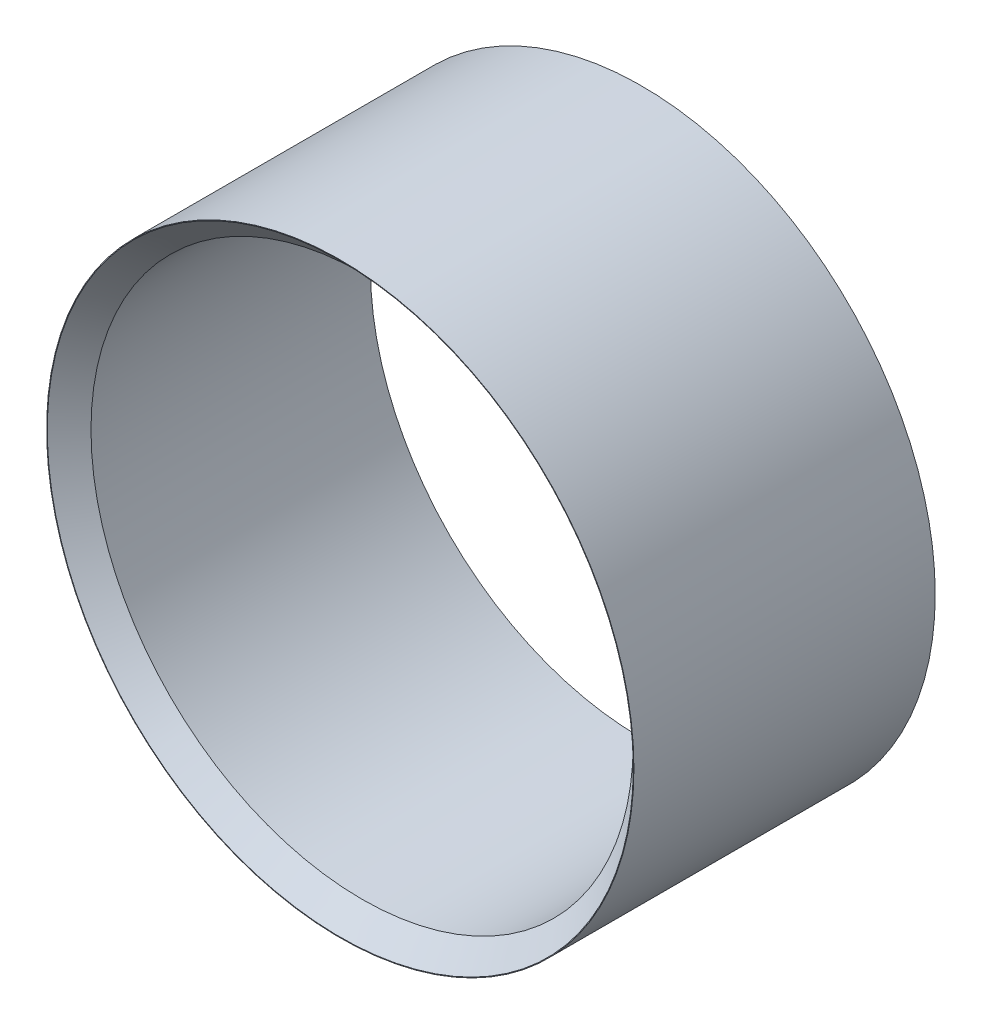
ISO-10303-21;
HEADER;
FILE_DESCRIPTION(('STEP AP214'),'2;1');
FILE_NAME('part.step','',(''),(''),'','','');
FILE_SCHEMA(('AUTOMOTIVE_DESIGN { 1 0 10303 214 1 1 1 1 }'));
ENDSEC;
DATA;
#1=APPLICATION_CONTEXT('core data for automotive mechanical design processes');
#2=APPLICATION_PROTOCOL_DEFINITION('international standard','automotive_design',2000,#1);
#3=PRODUCT_CONTEXT('',#1,'mechanical');
#4=PRODUCT('Part','Part','',(#3));
#5=PRODUCT_RELATED_PRODUCT_CATEGORY('part','',(#4));
#6=PRODUCT_DEFINITION_FORMATION('','',#4);
#7=PRODUCT_DEFINITION_CONTEXT('part definition',#1,'design');
#8=PRODUCT_DEFINITION('design','',#6,#7);
#9=PRODUCT_DEFINITION_SHAPE('','',#8);
#10=(LENGTH_UNIT() NAMED_UNIT(*) SI_UNIT(.MILLI.,.METRE.));
#11=(NAMED_UNIT(*) PLANE_ANGLE_UNIT() SI_UNIT($,.RADIAN.));
#12=(NAMED_UNIT(*) SI_UNIT($,.STERADIAN.) SOLID_ANGLE_UNIT());
#13=UNCERTAINTY_MEASURE_WITH_UNIT(LENGTH_MEASURE(1.E-05),#10,'distance_accuracy_value','');
#14=(GEOMETRIC_REPRESENTATION_CONTEXT(3) GLOBAL_UNCERTAINTY_ASSIGNED_CONTEXT((#13)) GLOBAL_UNIT_ASSIGNED_CONTEXT((#10,
#11,#12)) REPRESENTATION_CONTEXT('',''));
#15=CARTESIAN_POINT('',(0.,0.,0.));
#16=DIRECTION('',(0.,0.,1.));
#17=DIRECTION('',(1.,0.,0.));
#18=AXIS2_PLACEMENT_3D('',#15,#16,#17);
#19=CARTESIAN_POINT('',(0.,0.,17.5006));
#20=DIRECTION('',(0.,0.,1.));
#21=DIRECTION('',(1.,0.,0.));
#22=AXIS2_PLACEMENT_3D('',#19,#20,#21);
#23=PLANE('',#22);
#24=CARTESIAN_POINT('',(0.,0.,17.5006));
#25=DIRECTION('',(0.,0.,1.));
#26=DIRECTION('',(1.,0.,0.));
#27=AXIS2_PLACEMENT_3D('',#24,#25,#26);
#28=CIRCLE('',#27,17.018);
#29=CARTESIAN_POINT('',(17.018,0.,17.5006));
#30=VERTEX_POINT('',#29);
#31=EDGE_CURVE('E10',#30,#30,#28,.F.);
#32=ORIENTED_EDGE('',*,*,#31,.T.);
#33=EDGE_LOOP('',(#32));
#34=FACE_BOUND('',#33,.T.);
#35=CARTESIAN_POINT('',(0.,0.,17.5006));
#36=DIRECTION('',(0.,0.,1.));
#37=DIRECTION('',(1.,0.,0.));
#38=AXIS2_PLACEMENT_3D('',#35,#36,#37);
#39=CIRCLE('',#38,17.0561);
#40=CARTESIAN_POINT('',(17.0561,0.,17.5006));
#41=VERTEX_POINT('',#40);
#42=EDGE_CURVE('E51',#41,#41,#39,.T.);
#43=ORIENTED_EDGE('',*,*,#42,.T.);
#44=EDGE_LOOP('',(#43));
#45=FACE_BOUND('',#44,.T.);
#46=ADVANCED_FACE('F39',(#34,#45),#23,.T.);
#47=CARTESIAN_POINT('',(0.,0.,0.));
#48=DIRECTION('',(0.,0.,1.));
#49=DIRECTION('',(1.,0.,0.));
#50=AXIS2_PLACEMENT_3D('',#47,#48,#49);
#51=PLANE('',#50);
#52=CARTESIAN_POINT('',(0.,0.,0.));
#53=DIRECTION('',(0.,0.,1.));
#54=DIRECTION('',(1.,0.,0.));
#55=AXIS2_PLACEMENT_3D('',#52,#53,#54);
#56=CIRCLE('',#55,17.0561);
#57=CARTESIAN_POINT('',(17.0561,0.,0.));
#58=VERTEX_POINT('',#57);
#59=EDGE_CURVE('E55',#58,#58,#56,.T.);
#60=ORIENTED_EDGE('',*,*,#59,.F.);
#61=EDGE_LOOP('',(#60));
#62=FACE_BOUND('',#61,.T.);
#63=CARTESIAN_POINT('',(0.,0.,0.));
#64=DIRECTION('',(0.,0.,1.));
#65=DIRECTION('',(1.,0.,0.));
#66=AXIS2_PLACEMENT_3D('',#63,#64,#65);
#67=CIRCLE('',#66,15.748);
#68=CARTESIAN_POINT('',(15.748,0.,0.));
#69=VERTEX_POINT('',#68);
#70=EDGE_CURVE('E59',#69,#69,#67,.T.);
#71=ORIENTED_EDGE('',*,*,#70,.T.);
#72=EDGE_LOOP('',(#71));
#73=FACE_BOUND('',#72,.T.);
#74=ADVANCED_FACE('F64',(#62,#73),#51,.F.);
#75=CARTESIAN_POINT('',(0.,0.,17.5006));
#76=DIRECTION('',(0.,0.,-1.));
#77=DIRECTION('',(-1.,0.,0.));
#78=AXIS2_PLACEMENT_3D('',#75,#76,#77);
#79=CYLINDRICAL_SURFACE('',#78,17.0561);
#80=ORIENTED_EDGE('',*,*,#42,.F.);
#81=EDGE_LOOP('',(#80));
#82=FACE_BOUND('',#81,.T.);
#83=ORIENTED_EDGE('',*,*,#59,.T.);
#84=EDGE_LOOP('',(#83));
#85=FACE_BOUND('',#84,.T.);
#86=ADVANCED_FACE('F68',(#82,#85),#79,.T.);
#87=CARTESIAN_POINT('',(0.,0.,17.5006));
#88=DIRECTION('',(0.,0.,-1.));
#89=DIRECTION('',(-1.,0.,0.));
#90=AXIS2_PLACEMENT_3D('',#87,#88,#89);
#91=CYLINDRICAL_SURFACE('',#90,15.748);
#92=CARTESIAN_POINT('',(0.,0.,16.2306));
#93=DIRECTION('',(0.,0.,1.));
#94=DIRECTION('',(1.,0.,0.));
#95=AXIS2_PLACEMENT_3D('',#92,#93,#94);
#96=CIRCLE('',#95,15.748);
#97=CARTESIAN_POINT('',(15.748,0.,16.2306));
#98=VERTEX_POINT('',#97);
#99=EDGE_CURVE('E47',#98,#98,#96,.T.);
#100=ORIENTED_EDGE('',*,*,#99,.T.);
#101=EDGE_LOOP('',(#100));
#102=FACE_BOUND('',#101,.T.);
#103=ORIENTED_EDGE('',*,*,#70,.F.);
#104=EDGE_LOOP('',(#103));
#105=FACE_BOUND('',#104,.T.);
#106=ADVANCED_FACE('F66',(#102,#105),#91,.F.);
#107=CARTESIAN_POINT('',(0.,0.,16.2306));
#108=DIRECTION('',(0.,0.,1.));
#109=DIRECTION('',(1.,0.,0.));
#110=AXIS2_PLACEMENT_3D('',#107,#108,#109);
#111=CONICAL_SURFACE('',#110,15.748,0.785398163397451);
#112=ORIENTED_EDGE('',*,*,#31,.F.);
#113=EDGE_LOOP('',(#112));
#114=FACE_BOUND('',#113,.T.);
#115=ORIENTED_EDGE('',*,*,#99,.F.);
#116=EDGE_LOOP('',(#115));
#117=FACE_BOUND('',#116,.T.);
#118=ADVANCED_FACE('F42',(#114,#117),#111,.F.);
#119=CLOSED_SHELL('',(#46,#74,#86,#106,#118));
#120=MANIFOLD_SOLID_BREP('B2',#119);
#121=ADVANCED_BREP_SHAPE_REPRESENTATION('',(#18,#120),#14);
#122=SHAPE_DEFINITION_REPRESENTATION(#9,#121);
ENDSEC;
END-ISO-10303-21;
